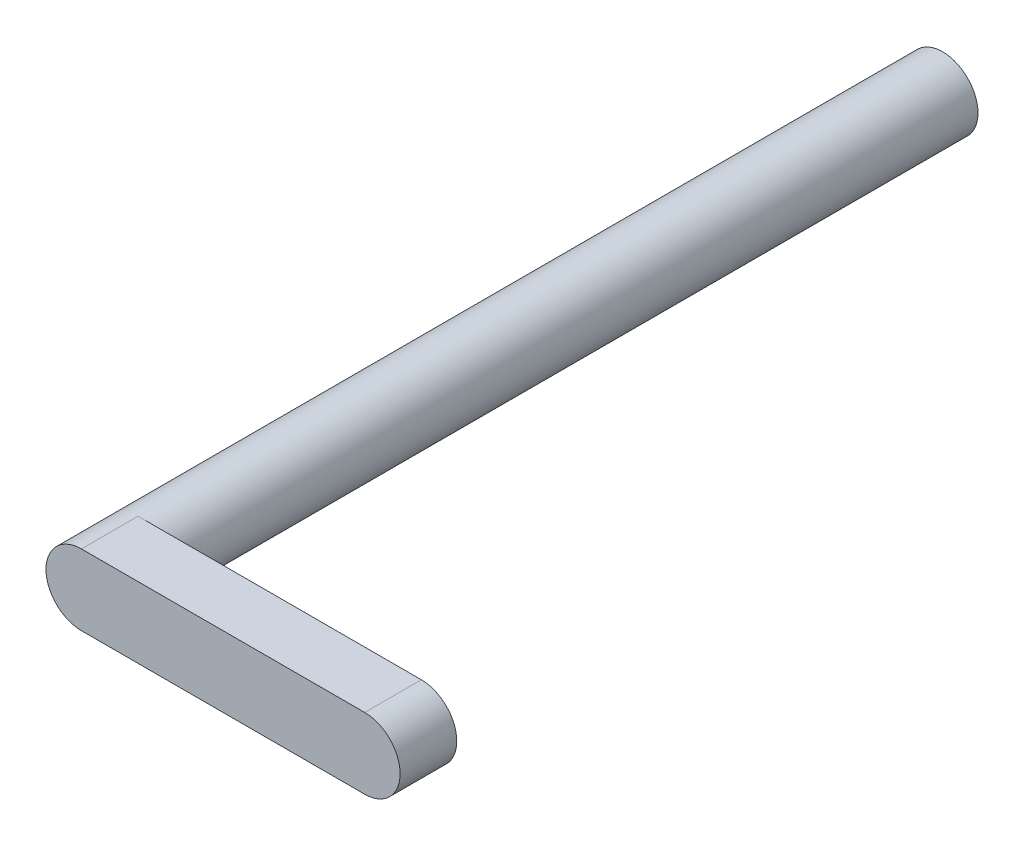
ISO-10303-21;
HEADER;
FILE_DESCRIPTION(('STEP AP214'),'2;1');
FILE_NAME('part.step','',(''),(''),'','','');
FILE_SCHEMA(('AUTOMOTIVE_DESIGN { 1 0 10303 214 1 1 1 1 }'));
ENDSEC;
DATA;
#1=APPLICATION_CONTEXT('core data for automotive mechanical design processes');
#2=APPLICATION_PROTOCOL_DEFINITION('international standard','automotive_design',2000,#1);
#3=PRODUCT_CONTEXT('',#1,'mechanical');
#4=PRODUCT('Part','Part','',(#3));
#5=PRODUCT_RELATED_PRODUCT_CATEGORY('part','',(#4));
#6=PRODUCT_DEFINITION_FORMATION('','',#4);
#7=PRODUCT_DEFINITION_CONTEXT('part definition',#1,'design');
#8=PRODUCT_DEFINITION('design','',#6,#7);
#9=PRODUCT_DEFINITION_SHAPE('','',#8);
#10=(LENGTH_UNIT() NAMED_UNIT(*) SI_UNIT(.MILLI.,.METRE.));
#11=(NAMED_UNIT(*) PLANE_ANGLE_UNIT() SI_UNIT($,.RADIAN.));
#12=(NAMED_UNIT(*) SI_UNIT($,.STERADIAN.) SOLID_ANGLE_UNIT());
#13=UNCERTAINTY_MEASURE_WITH_UNIT(LENGTH_MEASURE(1.E-05),#10,'distance_accuracy_value','');
#14=(GEOMETRIC_REPRESENTATION_CONTEXT(3) GLOBAL_UNCERTAINTY_ASSIGNED_CONTEXT((#13)) GLOBAL_UNIT_ASSIGNED_CONTEXT((#10,
#11,#12)) REPRESENTATION_CONTEXT('',''));
#15=CARTESIAN_POINT('',(0.,0.,0.));
#16=DIRECTION('',(0.,0.,1.));
#17=DIRECTION('',(1.,0.,0.));
#18=AXIS2_PLACEMENT_3D('',#15,#16,#17);
#19=CARTESIAN_POINT('',(0.,0.,19.304));
#20=DIRECTION('',(0.,0.,-1.));
#21=DIRECTION('',(-1.,0.,0.));
#22=AXIS2_PLACEMENT_3D('',#19,#20,#21);
#23=CYLINDRICAL_SURFACE('',#22,0.79375);
#24=CARTESIAN_POINT('',(0.,0.,0.));
#25=DIRECTION('',(0.,0.,1.));
#26=DIRECTION('',(1.,0.,0.));
#27=AXIS2_PLACEMENT_3D('',#24,#25,#26);
#28=CIRCLE('',#27,0.79375);
#29=CARTESIAN_POINT('',(0.79375,0.,0.));
#30=VERTEX_POINT('',#29);
#31=EDGE_CURVE('E125',#30,#30,#28,.T.);
#32=ORIENTED_EDGE('',*,*,#31,.T.);
#33=EDGE_LOOP('',(#32));
#34=FACE_BOUND('',#33,.T.);
#35=CARTESIAN_POINT('',(0.,0.,18.034));
#36=DIRECTION('',(0.,0.,1.));
#37=DIRECTION('',(1.,0.,0.));
#38=AXIS2_PLACEMENT_3D('',#35,#36,#37);
#39=CIRCLE('',#38,0.79375);
#40=CARTESIAN_POINT('',(0.,-0.79375,18.034));
#41=VERTEX_POINT('',#40);
#42=CARTESIAN_POINT('',(0.,0.79375,18.034));
#43=VERTEX_POINT('',#42);
#44=EDGE_CURVE('E11',#41,#43,#39,.T.);
#45=ORIENTED_EDGE('',*,*,#44,.F.);
#46=DIRECTION('',(0.,0.,1.));
#47=VECTOR('',#46,1.);
#48=CARTESIAN_POINT('',(0.,-0.79375,18.034));
#49=LINE('',#48,#47);
#50=CARTESIAN_POINT('',(0.,-0.79375,19.304));
#51=VERTEX_POINT('',#50);
#52=EDGE_CURVE('E89',#41,#51,#49,.T.);
#53=ORIENTED_EDGE('',*,*,#52,.T.);
#54=CARTESIAN_POINT('',(0.,0.,19.304));
#55=DIRECTION('',(0.,0.,1.));
#56=DIRECTION('',(1.,0.,0.));
#57=AXIS2_PLACEMENT_3D('',#54,#55,#56);
#58=CIRCLE('',#57,0.79375);
#59=CARTESIAN_POINT('',(0.,0.79375,19.304));
#60=VERTEX_POINT('',#59);
#61=EDGE_CURVE('E53',#60,#51,#58,.T.);
#62=ORIENTED_EDGE('',*,*,#61,.F.);
#63=DIRECTION('',(0.,0.,1.));
#64=VECTOR('',#63,1.);
#65=CARTESIAN_POINT('',(0.,0.79375,18.034));
#66=LINE('',#65,#64);
#67=EDGE_CURVE('E82',#43,#60,#66,.T.);
#68=ORIENTED_EDGE('',*,*,#67,.F.);
#69=EDGE_LOOP('',(#45,#53,#62,#68));
#70=FACE_BOUND('',#69,.T.);
#71=ADVANCED_FACE('F44',(#34,#70),#23,.T.);
#72=CARTESIAN_POINT('',(0.,0.,19.304));
#73=DIRECTION('',(0.,0.,1.));
#74=DIRECTION('',(1.,0.,0.));
#75=AXIS2_PLACEMENT_3D('',#72,#73,#74);
#76=PLANE('',#75);
#77=DIRECTION('',(1.,0.,0.));
#78=VECTOR('',#77,1.);
#79=CARTESIAN_POINT('',(0.,0.79375,19.304));
#80=LINE('',#79,#78);
#81=CARTESIAN_POINT('',(6.35,0.79375,19.304));
#82=VERTEX_POINT('',#81);
#83=EDGE_CURVE('E107',#60,#82,#80,.T.);
#84=ORIENTED_EDGE('',*,*,#83,.F.);
#85=ORIENTED_EDGE('',*,*,#61,.T.);
#86=DIRECTION('',(1.,0.,0.));
#87=VECTOR('',#86,1.);
#88=CARTESIAN_POINT('',(0.,-0.79375,19.304));
#89=LINE('',#88,#87);
#90=CARTESIAN_POINT('',(6.35,-0.79375,19.304));
#91=VERTEX_POINT('',#90);
#92=EDGE_CURVE('E113',#51,#91,#89,.T.);
#93=ORIENTED_EDGE('',*,*,#92,.T.);
#94=CARTESIAN_POINT('',(6.35,0.,19.304));
#95=DIRECTION('',(0.,0.,1.));
#96=DIRECTION('',(1.,0.,0.));
#97=AXIS2_PLACEMENT_3D('',#94,#95,#96);
#98=CIRCLE('',#97,0.79375);
#99=EDGE_CURVE('E100',#91,#82,#98,.T.);
#100=ORIENTED_EDGE('',*,*,#99,.T.);
#101=EDGE_LOOP('',(#84,#85,#93,#100));
#102=FACE_BOUND('',#101,.T.);
#103=ADVANCED_FACE('F137',(#102),#76,.T.);
#104=CARTESIAN_POINT('',(0.,0.,0.));
#105=DIRECTION('',(0.,0.,1.));
#106=DIRECTION('',(1.,0.,0.));
#107=AXIS2_PLACEMENT_3D('',#104,#105,#106);
#108=PLANE('',#107);
#109=ORIENTED_EDGE('',*,*,#31,.F.);
#110=EDGE_LOOP('',(#109));
#111=FACE_BOUND('',#110,.T.);
#112=ADVANCED_FACE('F132',(#111),#108,.F.);
#113=CARTESIAN_POINT('',(0.,0.79375,18.034));
#114=DIRECTION('',(0.,-1.,0.));
#115=DIRECTION('',(1.,0.,0.));
#116=AXIS2_PLACEMENT_3D('',#113,#114,#115);
#117=PLANE('',#116);
#118=ORIENTED_EDGE('',*,*,#83,.T.);
#119=DIRECTION('',(0.,0.,1.));
#120=VECTOR('',#119,1.);
#121=CARTESIAN_POINT('',(6.35,0.79375,18.034));
#122=LINE('',#121,#120);
#123=CARTESIAN_POINT('',(6.35,0.79375,18.034));
#124=VERTEX_POINT('',#123);
#125=EDGE_CURVE('E76',#124,#82,#122,.T.);
#126=ORIENTED_EDGE('',*,*,#125,.F.);
#127=DIRECTION('',(1.,0.,0.));
#128=VECTOR('',#127,1.);
#129=CARTESIAN_POINT('',(0.,0.79375,18.034));
#130=LINE('',#129,#128);
#131=EDGE_CURVE('E103',#43,#124,#130,.T.);
#132=ORIENTED_EDGE('',*,*,#131,.F.);
#133=ORIENTED_EDGE('',*,*,#67,.T.);
#134=EDGE_LOOP('',(#118,#126,#132,#133));
#135=FACE_BOUND('',#134,.T.);
#136=ADVANCED_FACE('F140',(#135),#117,.F.);
#137=CARTESIAN_POINT('',(6.35,0.,18.034));
#138=DIRECTION('',(0.,0.,1.));
#139=DIRECTION('',(1.,0.,0.));
#140=AXIS2_PLACEMENT_3D('',#137,#138,#139);
#141=CYLINDRICAL_SURFACE('',#140,0.79375);
#142=ORIENTED_EDGE('',*,*,#99,.F.);
#143=DIRECTION('',(0.,0.,1.));
#144=VECTOR('',#143,1.);
#145=CARTESIAN_POINT('',(6.35,-0.79375,18.034));
#146=LINE('',#145,#144);
#147=CARTESIAN_POINT('',(6.35,-0.79375,18.034));
#148=VERTEX_POINT('',#147);
#149=EDGE_CURVE('E95',#148,#91,#146,.T.);
#150=ORIENTED_EDGE('',*,*,#149,.F.);
#151=CARTESIAN_POINT('',(6.35,0.,18.034));
#152=DIRECTION('',(0.,0.,1.));
#153=DIRECTION('',(1.,0.,0.));
#154=AXIS2_PLACEMENT_3D('',#151,#152,#153);
#155=CIRCLE('',#154,0.79375);
#156=EDGE_CURVE('E92',#148,#124,#155,.T.);
#157=ORIENTED_EDGE('',*,*,#156,.T.);
#158=ORIENTED_EDGE('',*,*,#125,.T.);
#159=EDGE_LOOP('',(#142,#150,#157,#158));
#160=FACE_BOUND('',#159,.T.);
#161=ADVANCED_FACE('F94',(#160),#141,.T.);
#162=CARTESIAN_POINT('',(0.,-0.79375,18.034));
#163=DIRECTION('',(0.,-1.,0.));
#164=DIRECTION('',(1.,0.,0.));
#165=AXIS2_PLACEMENT_3D('',#162,#163,#164);
#166=PLANE('',#165);
#167=ORIENTED_EDGE('',*,*,#92,.F.);
#168=ORIENTED_EDGE('',*,*,#52,.F.);
#169=DIRECTION('',(1.,0.,0.));
#170=VECTOR('',#169,1.);
#171=CARTESIAN_POINT('',(0.,-0.79375,18.034));
#172=LINE('',#171,#170);
#173=EDGE_CURVE('E105',#41,#148,#172,.T.);
#174=ORIENTED_EDGE('',*,*,#173,.T.);
#175=ORIENTED_EDGE('',*,*,#149,.T.);
#176=EDGE_LOOP('',(#167,#168,#174,#175));
#177=FACE_BOUND('',#176,.T.);
#178=ADVANCED_FACE('F106',(#177),#166,.T.);
#179=CARTESIAN_POINT('',(0.,0.,18.034));
#180=DIRECTION('',(0.,0.,1.));
#181=DIRECTION('',(1.,0.,0.));
#182=AXIS2_PLACEMENT_3D('',#179,#180,#181);
#183=PLANE('',#182);
#184=ORIENTED_EDGE('',*,*,#173,.F.);
#185=ORIENTED_EDGE('',*,*,#44,.T.);
#186=ORIENTED_EDGE('',*,*,#131,.T.);
#187=ORIENTED_EDGE('',*,*,#156,.F.);
#188=EDGE_LOOP('',(#184,#185,#186,#187));
#189=FACE_BOUND('',#188,.T.);
#190=ADVANCED_FACE('F101',(#189),#183,.F.);
#191=CLOSED_SHELL('',(#71,#103,#112,#136,#161,#178,#190));
#192=MANIFOLD_SOLID_BREP('B2',#191);
#193=ADVANCED_BREP_SHAPE_REPRESENTATION('',(#18,#192),#14);
#194=SHAPE_DEFINITION_REPRESENTATION(#9,#193);
ENDSEC;
END-ISO-10303-21;
